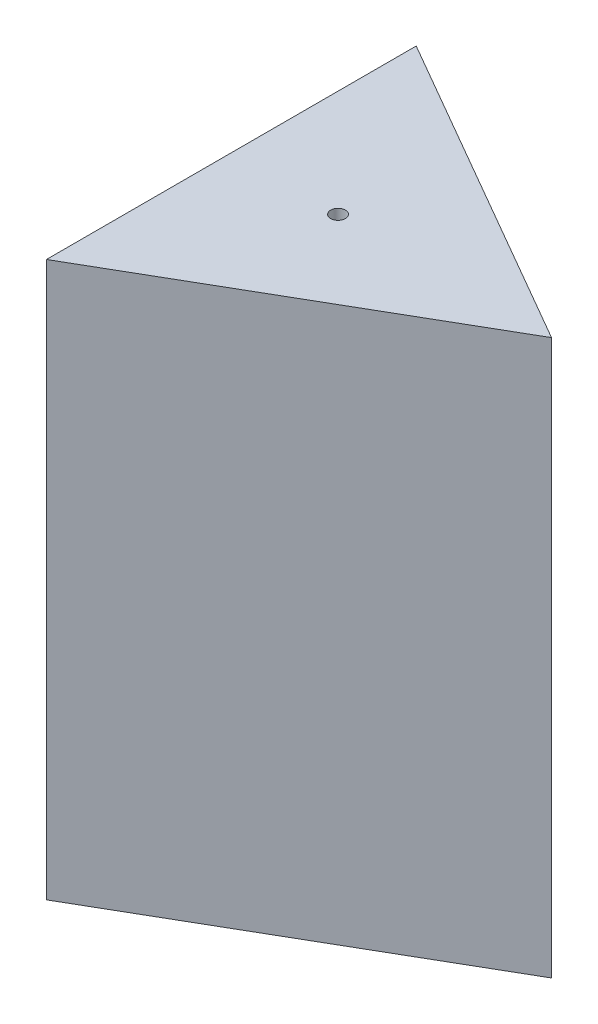
ISO-10303-21;
HEADER;
FILE_DESCRIPTION(('STEP AP214'),'2;1');
FILE_NAME('part.step','',(''),(''),'','','');
FILE_SCHEMA(('AUTOMOTIVE_DESIGN { 1 0 10303 214 1 1 1 1 }'));
ENDSEC;
DATA;
#1=APPLICATION_CONTEXT('core data for automotive mechanical design processes');
#2=APPLICATION_PROTOCOL_DEFINITION('international standard','automotive_design',2000,#1);
#3=PRODUCT_CONTEXT('',#1,'mechanical');
#4=PRODUCT('Part','Part','',(#3));
#5=PRODUCT_RELATED_PRODUCT_CATEGORY('part','',(#4));
#6=PRODUCT_DEFINITION_FORMATION('','',#4);
#7=PRODUCT_DEFINITION_CONTEXT('part definition',#1,'design');
#8=PRODUCT_DEFINITION('design','',#6,#7);
#9=PRODUCT_DEFINITION_SHAPE('','',#8);
#10=(LENGTH_UNIT() NAMED_UNIT(*) SI_UNIT(.MILLI.,.METRE.));
#11=(NAMED_UNIT(*) PLANE_ANGLE_UNIT() SI_UNIT($,.RADIAN.));
#12=(NAMED_UNIT(*) SI_UNIT($,.STERADIAN.) SOLID_ANGLE_UNIT());
#13=UNCERTAINTY_MEASURE_WITH_UNIT(LENGTH_MEASURE(1.E-05),#10,'distance_accuracy_value','');
#14=(GEOMETRIC_REPRESENTATION_CONTEXT(3) GLOBAL_UNCERTAINTY_ASSIGNED_CONTEXT((#13)) GLOBAL_UNIT_ASSIGNED_CONTEXT((#10,
#11,#12)) REPRESENTATION_CONTEXT('',''));
#15=CARTESIAN_POINT('',(0.,0.,0.));
#16=DIRECTION('',(0.,0.,1.));
#17=DIRECTION('',(1.,0.,0.));
#18=AXIS2_PLACEMENT_3D('',#15,#16,#17);
#19=CARTESIAN_POINT('',(-57.7350269189626,300.,100.));
#20=DIRECTION('',(-0.5,0.,-0.866025403784438));
#21=DIRECTION('',(-0.866025403784439,0.,0.5));
#22=AXIS2_PLACEMENT_3D('',#19,#20,#21);
#23=PLANE('',#22);
#24=DIRECTION('',(0.866025403784438,0.,-0.5));
#25=VECTOR('',#24,1.);
#26=CARTESIAN_POINT('',(-57.7350269189626,0.,100.));
#27=LINE('',#26,#25);
#28=CARTESIAN_POINT('',(-57.7350269189626,0.,100.));
#29=VERTEX_POINT('',#28);
#30=CARTESIAN_POINT('',(115.470053837925,0.,0.));
#31=VERTEX_POINT('',#30);
#32=EDGE_CURVE('E89',#29,#31,#27,.T.);
#33=ORIENTED_EDGE('',*,*,#32,.T.);
#34=DIRECTION('',(0.,-1.,0.));
#35=VECTOR('',#34,1.);
#36=CARTESIAN_POINT('',(115.470053837925,300.,0.));
#37=LINE('',#36,#35);
#38=CARTESIAN_POINT('',(115.470053837925,300.,0.));
#39=VERTEX_POINT('',#38);
#40=EDGE_CURVE('E11',#39,#31,#37,.T.);
#41=ORIENTED_EDGE('',*,*,#40,.F.);
#42=DIRECTION('',(0.866025403784438,0.,-0.5));
#43=VECTOR('',#42,1.);
#44=CARTESIAN_POINT('',(-57.7350269189626,300.,100.));
#45=LINE('',#44,#43);
#46=CARTESIAN_POINT('',(-57.7350269189626,300.,100.));
#47=VERTEX_POINT('',#46);
#48=EDGE_CURVE('E81',#47,#39,#45,.T.);
#49=ORIENTED_EDGE('',*,*,#48,.F.);
#50=DIRECTION('',(0.,-1.,0.));
#51=VECTOR('',#50,1.);
#52=CARTESIAN_POINT('',(-57.7350269189626,300.,100.));
#53=LINE('',#52,#51);
#54=EDGE_CURVE('E90',#47,#29,#53,.T.);
#55=ORIENTED_EDGE('',*,*,#54,.T.);
#56=EDGE_LOOP('',(#33,#41,#49,#55));
#57=FACE_BOUND('',#56,.T.);
#58=ADVANCED_FACE('F39',(#57),#23,.F.);
#59=CARTESIAN_POINT('',(115.470053837925,300.,0.));
#60=DIRECTION('',(-0.5,0.,0.866025403784439));
#61=DIRECTION('',(0.866025403784439,0.,0.5));
#62=AXIS2_PLACEMENT_3D('',#59,#60,#61);
#63=PLANE('',#62);
#64=DIRECTION('',(-0.866025403784439,0.,-0.5));
#65=VECTOR('',#64,1.);
#66=CARTESIAN_POINT('',(115.470053837925,0.,0.));
#67=LINE('',#66,#65);
#68=CARTESIAN_POINT('',(-57.7350269189625,0.,-100.));
#69=VERTEX_POINT('',#68);
#70=EDGE_CURVE('E68',#31,#69,#67,.T.);
#71=ORIENTED_EDGE('',*,*,#70,.T.);
#72=DIRECTION('',(0.,-1.,0.));
#73=VECTOR('',#72,1.);
#74=CARTESIAN_POINT('',(-57.7350269189625,300.,-100.));
#75=LINE('',#74,#73);
#76=CARTESIAN_POINT('',(-57.7350269189625,300.,-100.));
#77=VERTEX_POINT('',#76);
#78=EDGE_CURVE('E48',#77,#69,#75,.T.);
#79=ORIENTED_EDGE('',*,*,#78,.F.);
#80=DIRECTION('',(-0.866025403784439,0.,-0.5));
#81=VECTOR('',#80,1.);
#82=CARTESIAN_POINT('',(115.470053837925,300.,0.));
#83=LINE('',#82,#81);
#84=EDGE_CURVE('E76',#39,#77,#83,.T.);
#85=ORIENTED_EDGE('',*,*,#84,.F.);
#86=ORIENTED_EDGE('',*,*,#40,.T.);
#87=EDGE_LOOP('',(#71,#79,#85,#86));
#88=FACE_BOUND('',#87,.T.);
#89=ADVANCED_FACE('F77',(#88),#63,.F.);
#90=CARTESIAN_POINT('',(-57.7350269189625,300.,-100.));
#91=DIRECTION('',(1.,0.,0.));
#92=DIRECTION('',(0.,0.,-1.));
#93=AXIS2_PLACEMENT_3D('',#90,#91,#92);
#94=PLANE('',#93);
#95=DIRECTION('',(0.,0.,1.));
#96=VECTOR('',#95,1.);
#97=CARTESIAN_POINT('',(-57.7350269189625,0.,-100.));
#98=LINE('',#97,#96);
#99=EDGE_CURVE('E73',#69,#29,#98,.T.);
#100=ORIENTED_EDGE('',*,*,#99,.T.);
#101=ORIENTED_EDGE('',*,*,#54,.F.);
#102=DIRECTION('',(0.,0.,1.));
#103=VECTOR('',#102,1.);
#104=CARTESIAN_POINT('',(-57.7350269189625,300.,-100.));
#105=LINE('',#104,#103);
#106=EDGE_CURVE('E56',#77,#47,#105,.T.);
#107=ORIENTED_EDGE('',*,*,#106,.F.);
#108=ORIENTED_EDGE('',*,*,#78,.T.);
#109=EDGE_LOOP('',(#100,#101,#107,#108));
#110=FACE_BOUND('',#109,.T.);
#111=ADVANCED_FACE('F107',(#110),#94,.F.);
#112=CARTESIAN_POINT('',(0.,300.,0.));
#113=DIRECTION('',(0.,1.,0.));
#114=DIRECTION('',(0.,0.,1.));
#115=AXIS2_PLACEMENT_3D('',#112,#113,#114);
#116=PLANE('',#115);
#117=CARTESIAN_POINT('',(0.,300.,0.));
#118=DIRECTION('',(0.,-1.,0.));
#119=DIRECTION('',(0.,0.,-1.));
#120=AXIS2_PLACEMENT_3D('',#117,#118,#119);
#121=CIRCLE('',#120,4.);
#122=CARTESIAN_POINT('',(0.,300.,-4.));
#123=VERTEX_POINT('',#122);
#124=EDGE_CURVE('E93',#123,#123,#121,.T.);
#125=ORIENTED_EDGE('',*,*,#124,.T.);
#126=EDGE_LOOP('',(#125));
#127=FACE_BOUND('',#126,.T.);
#128=ORIENTED_EDGE('',*,*,#48,.T.);
#129=ORIENTED_EDGE('',*,*,#84,.T.);
#130=ORIENTED_EDGE('',*,*,#106,.T.);
#131=EDGE_LOOP('',(#128,#129,#130));
#132=FACE_BOUND('',#131,.T.);
#133=ADVANCED_FACE('F84',(#127,#132),#116,.T.);
#134=CARTESIAN_POINT('',(0.,0.,0.));
#135=DIRECTION('',(0.,1.,0.));
#136=DIRECTION('',(0.,0.,1.));
#137=AXIS2_PLACEMENT_3D('',#134,#135,#136);
#138=PLANE('',#137);
#139=CARTESIAN_POINT('',(0.,0.,0.));
#140=DIRECTION('',(0.,-1.,0.));
#141=DIRECTION('',(0.,0.,-1.));
#142=AXIS2_PLACEMENT_3D('',#139,#140,#141);
#143=CIRCLE('',#142,4.);
#144=CARTESIAN_POINT('',(0.,0.,-4.));
#145=VERTEX_POINT('',#144);
#146=EDGE_CURVE('E99',#145,#145,#143,.T.);
#147=ORIENTED_EDGE('',*,*,#146,.F.);
#148=EDGE_LOOP('',(#147));
#149=FACE_BOUND('',#148,.T.);
#150=ORIENTED_EDGE('',*,*,#32,.F.);
#151=ORIENTED_EDGE('',*,*,#99,.F.);
#152=ORIENTED_EDGE('',*,*,#70,.F.);
#153=EDGE_LOOP('',(#150,#151,#152));
#154=FACE_BOUND('',#153,.T.);
#155=ADVANCED_FACE('F108',(#149,#154),#138,.F.);
#156=CARTESIAN_POINT('',(0.,300.,0.));
#157=DIRECTION('',(0.,-1.,0.));
#158=DIRECTION('',(0.,0.,-1.));
#159=AXIS2_PLACEMENT_3D('',#156,#157,#158);
#160=CYLINDRICAL_SURFACE('',#159,4.);
#161=ORIENTED_EDGE('',*,*,#124,.F.);
#162=EDGE_LOOP('',(#161));
#163=FACE_BOUND('',#162,.T.);
#164=ORIENTED_EDGE('',*,*,#146,.T.);
#165=EDGE_LOOP('',(#164));
#166=FACE_BOUND('',#165,.T.);
#167=ADVANCED_FACE('F110',(#163,#166),#160,.F.);
#168=CLOSED_SHELL('',(#58,#89,#111,#133,#155,#167));
#169=MANIFOLD_SOLID_BREP('B2',#168);
#170=ADVANCED_BREP_SHAPE_REPRESENTATION('',(#18,#169),#14);
#171=SHAPE_DEFINITION_REPRESENTATION(#9,#170);
ENDSEC;
END-ISO-10303-21;
